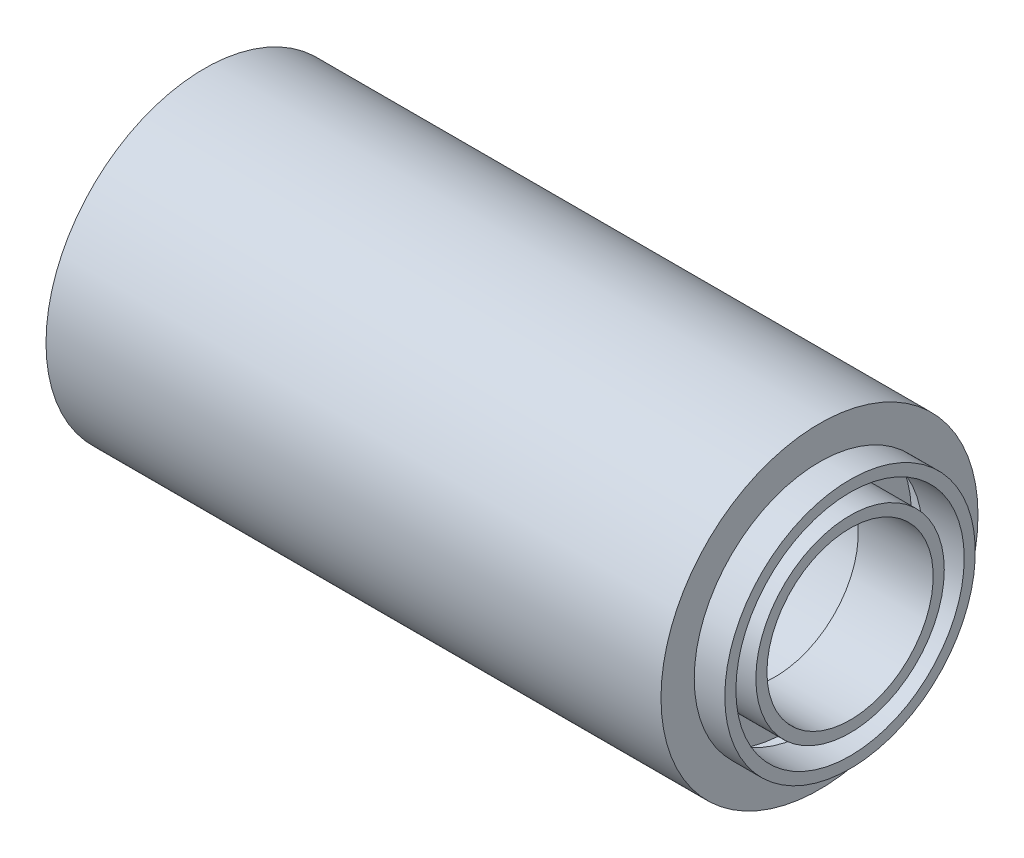
ISO-10303-21;
HEADER;
FILE_DESCRIPTION(('STEP AP214'),'2;1');
FILE_NAME('part.step','',(''),(''),'','','');
FILE_SCHEMA(('AUTOMOTIVE_DESIGN { 1 0 10303 214 1 1 1 1 }'));
ENDSEC;
DATA;
#1=APPLICATION_CONTEXT('core data for automotive mechanical design processes');
#2=APPLICATION_PROTOCOL_DEFINITION('international standard','automotive_design',2000,#1);
#3=PRODUCT_CONTEXT('',#1,'mechanical');
#4=PRODUCT('Part','Part','',(#3));
#5=PRODUCT_RELATED_PRODUCT_CATEGORY('part','',(#4));
#6=PRODUCT_DEFINITION_FORMATION('','',#4);
#7=PRODUCT_DEFINITION_CONTEXT('part definition',#1,'design');
#8=PRODUCT_DEFINITION('design','',#6,#7);
#9=PRODUCT_DEFINITION_SHAPE('','',#8);
#10=(LENGTH_UNIT() NAMED_UNIT(*) SI_UNIT(.MILLI.,.METRE.));
#11=(NAMED_UNIT(*) PLANE_ANGLE_UNIT() SI_UNIT($,.RADIAN.));
#12=(NAMED_UNIT(*) SI_UNIT($,.STERADIAN.) SOLID_ANGLE_UNIT());
#13=UNCERTAINTY_MEASURE_WITH_UNIT(LENGTH_MEASURE(1.E-05),#10,'distance_accuracy_value','');
#14=(GEOMETRIC_REPRESENTATION_CONTEXT(3) GLOBAL_UNCERTAINTY_ASSIGNED_CONTEXT((#13)) GLOBAL_UNIT_ASSIGNED_CONTEXT((#10,
#11,#12)) REPRESENTATION_CONTEXT('',''));
#15=CARTESIAN_POINT('',(0.,0.,0.));
#16=DIRECTION('',(0.,0.,1.));
#17=DIRECTION('',(1.,0.,0.));
#18=AXIS2_PLACEMENT_3D('',#15,#16,#17);
#19=CARTESIAN_POINT('',(-5.08,33.782,0.));
#20=DIRECTION('',(1.,0.,0.));
#21=DIRECTION('',(0.,0.,-1.));
#22=AXIS2_PLACEMENT_3D('',#19,#20,#21);
#23=PLANE('',#22);
#24=CARTESIAN_POINT('',(-5.08,0.,0.));
#25=DIRECTION('',(-1.,0.,0.));
#26=DIRECTION('',(0.,0.,1.));
#27=AXIS2_PLACEMENT_3D('',#24,#25,#26);
#28=CIRCLE('',#27,26.162);
#29=CARTESIAN_POINT('',(-5.08,0.,26.162));
#30=VERTEX_POINT('',#29);
#31=EDGE_CURVE('E86',#30,#30,#28,.T.);
#32=ORIENTED_EDGE('',*,*,#31,.T.);
#33=EDGE_LOOP('',(#32));
#34=FACE_BOUND('',#33,.T.);
#35=CARTESIAN_POINT('',(-5.08,0.,0.));
#36=DIRECTION('',(-1.,0.,0.));
#37=DIRECTION('',(0.,0.,1.));
#38=AXIS2_PLACEMENT_3D('',#35,#36,#37);
#39=CIRCLE('',#38,33.782);
#40=CARTESIAN_POINT('',(-5.08,0.,33.782));
#41=VERTEX_POINT('',#40);
#42=EDGE_CURVE('E11',#41,#41,#39,.T.);
#43=ORIENTED_EDGE('',*,*,#42,.F.);
#44=EDGE_LOOP('',(#43));
#45=FACE_BOUND('',#44,.T.);
#46=ADVANCED_FACE('F45',(#34,#45),#23,.T.);
#47=CARTESIAN_POINT('',(0.,0.,0.));
#48=DIRECTION('',(-1.,0.,0.));
#49=DIRECTION('',(0.,0.,1.));
#50=AXIS2_PLACEMENT_3D('',#47,#48,#49);
#51=CYLINDRICAL_SURFACE('',#50,26.162);
#52=CARTESIAN_POINT('',(-12.0906426511695,0.,0.));
#53=DIRECTION('',(-1.,0.,0.));
#54=DIRECTION('',(0.,0.,1.));
#55=AXIS2_PLACEMENT_3D('',#52,#53,#54);
#56=CIRCLE('',#55,26.162);
#57=CARTESIAN_POINT('',(-12.0906426511695,0.,26.162));
#58=VERTEX_POINT('',#57);
#59=EDGE_CURVE('E83',#58,#58,#56,.T.);
#60=ORIENTED_EDGE('',*,*,#59,.T.);
#61=EDGE_LOOP('',(#60));
#62=FACE_BOUND('',#61,.T.);
#63=ORIENTED_EDGE('',*,*,#31,.F.);
#64=EDGE_LOOP('',(#63));
#65=FACE_BOUND('',#64,.T.);
#66=ADVANCED_FACE('F92',(#62,#65),#51,.F.);
#67=CARTESIAN_POINT('',(-12.0906426511695,28.702,0.));
#68=DIRECTION('',(1.,0.,0.));
#69=DIRECTION('',(0.,0.,-1.));
#70=AXIS2_PLACEMENT_3D('',#67,#68,#69);
#71=PLANE('',#70);
#72=ORIENTED_EDGE('',*,*,#59,.F.);
#73=EDGE_LOOP('',(#72));
#74=FACE_BOUND('',#73,.T.);
#75=CARTESIAN_POINT('',(-12.0906426511695,0.,0.));
#76=DIRECTION('',(-1.,0.,0.));
#77=DIRECTION('',(0.,0.,1.));
#78=AXIS2_PLACEMENT_3D('',#75,#76,#77);
#79=CIRCLE('',#78,28.702);
#80=CARTESIAN_POINT('',(-12.0906426511695,0.,28.702));
#81=VERTEX_POINT('',#80);
#82=EDGE_CURVE('E80',#81,#81,#79,.T.);
#83=ORIENTED_EDGE('',*,*,#82,.T.);
#84=EDGE_LOOP('',(#83));
#85=FACE_BOUND('',#84,.T.);
#86=ADVANCED_FACE('F94',(#74,#85),#71,.F.);
#87=CARTESIAN_POINT('',(0.,0.,0.));
#88=DIRECTION('',(-1.,0.,0.));
#89=DIRECTION('',(0.,0.,1.));
#90=AXIS2_PLACEMENT_3D('',#87,#88,#89);
#91=CYLINDRICAL_SURFACE('',#90,28.702);
#92=CARTESIAN_POINT('',(-7.62,0.,0.));
#93=DIRECTION('',(-1.,0.,0.));
#94=DIRECTION('',(0.,0.,1.));
#95=AXIS2_PLACEMENT_3D('',#92,#93,#94);
#96=CIRCLE('',#95,28.702);
#97=CARTESIAN_POINT('',(-7.62,0.,28.702));
#98=VERTEX_POINT('',#97);
#99=EDGE_CURVE('E77',#98,#98,#96,.T.);
#100=ORIENTED_EDGE('',*,*,#99,.T.);
#101=EDGE_LOOP('',(#100));
#102=FACE_BOUND('',#101,.T.);
#103=ORIENTED_EDGE('',*,*,#82,.F.);
#104=EDGE_LOOP('',(#103));
#105=FACE_BOUND('',#104,.T.);
#106=ADVANCED_FACE('F101',(#102,#105),#91,.T.);
#107=CARTESIAN_POINT('',(-7.62,28.702,0.));
#108=DIRECTION('',(-1.,0.,0.));
#109=DIRECTION('',(0.,0.,1.));
#110=AXIS2_PLACEMENT_3D('',#107,#108,#109);
#111=PLANE('',#110);
#112=CARTESIAN_POINT('',(-7.62,0.,0.));
#113=DIRECTION('',(-1.,0.,0.));
#114=DIRECTION('',(0.,0.,1.));
#115=AXIS2_PLACEMENT_3D('',#112,#113,#114);
#116=CIRCLE('',#115,36.322);
#117=CARTESIAN_POINT('',(-7.62,0.,36.322));
#118=VERTEX_POINT('',#117);
#119=EDGE_CURVE('E74',#118,#118,#116,.T.);
#120=ORIENTED_EDGE('',*,*,#119,.T.);
#121=EDGE_LOOP('',(#120));
#122=FACE_BOUND('',#121,.T.);
#123=ORIENTED_EDGE('',*,*,#99,.F.);
#124=EDGE_LOOP('',(#123));
#125=FACE_BOUND('',#124,.T.);
#126=ADVANCED_FACE('F108',(#122,#125),#111,.T.);
#127=CARTESIAN_POINT('',(0.,0.,0.));
#128=DIRECTION('',(-1.,0.,0.));
#129=DIRECTION('',(0.,0.,1.));
#130=AXIS2_PLACEMENT_3D('',#127,#128,#129);
#131=CYLINDRICAL_SURFACE('',#130,36.322);
#132=CARTESIAN_POINT('',(133.304670970161,0.,0.));
#133=DIRECTION('',(-1.,0.,0.));
#134=DIRECTION('',(0.,0.,1.));
#135=AXIS2_PLACEMENT_3D('',#132,#133,#134);
#136=CIRCLE('',#135,36.322);
#137=CARTESIAN_POINT('',(133.304670970161,0.,36.322));
#138=VERTEX_POINT('',#137);
#139=EDGE_CURVE('E71',#138,#138,#136,.T.);
#140=ORIENTED_EDGE('',*,*,#139,.T.);
#141=EDGE_LOOP('',(#140));
#142=FACE_BOUND('',#141,.T.);
#143=ORIENTED_EDGE('',*,*,#119,.F.);
#144=EDGE_LOOP('',(#143));
#145=FACE_BOUND('',#144,.T.);
#146=ADVANCED_FACE('F112',(#142,#145),#131,.T.);
#147=CARTESIAN_POINT('',(133.304670970161,28.702,0.));
#148=DIRECTION('',(-1.,0.,0.));
#149=DIRECTION('',(0.,0.,1.));
#150=AXIS2_PLACEMENT_3D('',#147,#148,#149);
#151=PLANE('',#150);
#152=ORIENTED_EDGE('',*,*,#139,.F.);
#153=EDGE_LOOP('',(#152));
#154=FACE_BOUND('',#153,.T.);
#155=CARTESIAN_POINT('',(133.304670970161,0.,0.));
#156=DIRECTION('',(-1.,0.,0.));
#157=DIRECTION('',(0.,0.,1.));
#158=AXIS2_PLACEMENT_3D('',#155,#156,#157);
#159=CIRCLE('',#158,28.702);
#160=CARTESIAN_POINT('',(133.304670970161,0.,28.702));
#161=VERTEX_POINT('',#160);
#162=EDGE_CURVE('E68',#161,#161,#159,.T.);
#163=ORIENTED_EDGE('',*,*,#162,.T.);
#164=EDGE_LOOP('',(#163));
#165=FACE_BOUND('',#164,.T.);
#166=ADVANCED_FACE('F116',(#154,#165),#151,.F.);
#167=CARTESIAN_POINT('',(0.,0.,0.));
#168=DIRECTION('',(-1.,0.,0.));
#169=DIRECTION('',(0.,0.,1.));
#170=AXIS2_PLACEMENT_3D('',#167,#168,#169);
#171=CYLINDRICAL_SURFACE('',#170,28.702);
#172=ORIENTED_EDGE('',*,*,#162,.F.);
#173=EDGE_LOOP('',(#172));
#174=FACE_BOUND('',#173,.T.);
#175=CARTESIAN_POINT('',(140.309357348831,0.,0.));
#176=DIRECTION('',(-1.,0.,0.));
#177=DIRECTION('',(0.,0.,1.));
#178=AXIS2_PLACEMENT_3D('',#175,#176,#177);
#179=CIRCLE('',#178,28.702);
#180=CARTESIAN_POINT('',(140.309357348831,0.,28.702));
#181=VERTEX_POINT('',#180);
#182=EDGE_CURVE('E65',#181,#181,#179,.T.);
#183=ORIENTED_EDGE('',*,*,#182,.T.);
#184=EDGE_LOOP('',(#183));
#185=FACE_BOUND('',#184,.T.);
#186=ADVANCED_FACE('F120',(#174,#185),#171,.T.);
#187=CARTESIAN_POINT('',(140.309357348831,26.162,0.));
#188=DIRECTION('',(-1.,0.,0.));
#189=DIRECTION('',(0.,0.,1.));
#190=AXIS2_PLACEMENT_3D('',#187,#188,#189);
#191=PLANE('',#190);
#192=ORIENTED_EDGE('',*,*,#182,.F.);
#193=EDGE_LOOP('',(#192));
#194=FACE_BOUND('',#193,.T.);
#195=CARTESIAN_POINT('',(140.309357348831,0.,0.));
#196=DIRECTION('',(-1.,0.,0.));
#197=DIRECTION('',(0.,0.,1.));
#198=AXIS2_PLACEMENT_3D('',#195,#196,#197);
#199=CIRCLE('',#198,26.162);
#200=CARTESIAN_POINT('',(140.309357348831,0.,26.162));
#201=VERTEX_POINT('',#200);
#202=EDGE_CURVE('E60',#201,#201,#199,.T.);
#203=ORIENTED_EDGE('',*,*,#202,.T.);
#204=EDGE_LOOP('',(#203));
#205=FACE_BOUND('',#204,.T.);
#206=ADVANCED_FACE('F124',(#194,#205),#191,.F.);
#207=CARTESIAN_POINT('',(0.,0.,0.));
#208=DIRECTION('',(-1.,0.,0.));
#209=DIRECTION('',(0.,0.,1.));
#210=AXIS2_PLACEMENT_3D('',#207,#208,#209);
#211=CYLINDRICAL_SURFACE('',#210,26.162);
#212=ORIENTED_EDGE('',*,*,#202,.F.);
#213=EDGE_LOOP('',(#212));
#214=FACE_BOUND('',#213,.T.);
#215=CARTESIAN_POINT('',(130.764670970161,0.,0.));
#216=DIRECTION('',(-1.,0.,0.));
#217=DIRECTION('',(0.,0.,1.));
#218=AXIS2_PLACEMENT_3D('',#215,#216,#217);
#219=CIRCLE('',#218,26.162);
#220=CARTESIAN_POINT('',(130.764670970161,0.,26.162));
#221=VERTEX_POINT('',#220);
#222=EDGE_CURVE('E56',#221,#221,#219,.T.);
#223=ORIENTED_EDGE('',*,*,#222,.T.);
#224=EDGE_LOOP('',(#223));
#225=FACE_BOUND('',#224,.T.);
#226=ADVANCED_FACE('F128',(#214,#225),#211,.F.);
#227=CARTESIAN_POINT('',(130.764670970161,33.782,0.));
#228=DIRECTION('',(1.,0.,0.));
#229=DIRECTION('',(0.,0.,-1.));
#230=AXIS2_PLACEMENT_3D('',#227,#228,#229);
#231=PLANE('',#230);
#232=ORIENTED_EDGE('',*,*,#222,.F.);
#233=EDGE_LOOP('',(#232));
#234=FACE_BOUND('',#233,.T.);
#235=CARTESIAN_POINT('',(130.764670970161,0.,0.));
#236=DIRECTION('',(-1.,0.,0.));
#237=DIRECTION('',(0.,0.,1.));
#238=AXIS2_PLACEMENT_3D('',#235,#236,#237);
#239=CIRCLE('',#238,33.782);
#240=CARTESIAN_POINT('',(130.764670970161,0.,33.782));
#241=VERTEX_POINT('',#240);
#242=EDGE_CURVE('E52',#241,#241,#239,.T.);
#243=ORIENTED_EDGE('',*,*,#242,.T.);
#244=EDGE_LOOP('',(#243));
#245=FACE_BOUND('',#244,.T.);
#246=ADVANCED_FACE('F131',(#234,#245),#231,.F.);
#247=CARTESIAN_POINT('',(0.,0.,0.));
#248=DIRECTION('',(-1.,0.,0.));
#249=DIRECTION('',(0.,0.,1.));
#250=AXIS2_PLACEMENT_3D('',#247,#248,#249);
#251=CYLINDRICAL_SURFACE('',#250,33.782);
#252=ORIENTED_EDGE('',*,*,#242,.F.);
#253=EDGE_LOOP('',(#252));
#254=FACE_BOUND('',#253,.T.);
#255=ORIENTED_EDGE('',*,*,#42,.T.);
#256=EDGE_LOOP('',(#255));
#257=FACE_BOUND('',#256,.T.);
#258=ADVANCED_FACE('F47',(#254,#257),#251,.F.);
#259=CLOSED_SHELL('',(#46,#66,#86,#106,#126,#146,#166,#186,#206,#226,#246,#258));
#260=MANIFOLD_SOLID_BREP('B2',#259);
#261=CARTESIAN_POINT('',(0.,0.,0.));
#262=DIRECTION('',(-1.,0.,0.));
#263=DIRECTION('',(0.,0.,1.));
#264=AXIS2_PLACEMENT_3D('',#261,#262,#263);
#265=CYLINDRICAL_SURFACE('',#264,21.59);
#266=CARTESIAN_POINT('',(125.684670970161,0.,0.));
#267=DIRECTION('',(-1.,0.,0.));
#268=DIRECTION('',(0.,0.,1.));
#269=AXIS2_PLACEMENT_3D('',#266,#267,#268);
#270=CIRCLE('',#269,21.59);
#271=CARTESIAN_POINT('',(125.684670970161,0.,21.59));
#272=VERTEX_POINT('',#271);
#273=EDGE_CURVE('E44',#272,#272,#270,.T.);
#274=ORIENTED_EDGE('',*,*,#273,.F.);
#275=EDGE_LOOP('',(#274));
#276=FACE_BOUND('',#275,.T.);
#277=CARTESIAN_POINT('',(140.309357348831,0.,0.));
#278=DIRECTION('',(-1.,0.,0.));
#279=DIRECTION('',(0.,0.,1.));
#280=AXIS2_PLACEMENT_3D('',#277,#278,#279);
#281=CIRCLE('',#280,21.59);
#282=CARTESIAN_POINT('',(140.309357348831,0.,21.59));
#283=VERTEX_POINT('',#282);
#284=EDGE_CURVE('E291',#283,#283,#281,.T.);
#285=ORIENTED_EDGE('',*,*,#284,.T.);
#286=EDGE_LOOP('',(#285));
#287=FACE_BOUND('',#286,.T.);
#288=ADVANCED_FACE('F251',(#276,#287),#265,.T.);
#289=CARTESIAN_POINT('',(125.684670970161,0.,0.));
#290=DIRECTION('',(-1.,0.,0.));
#291=DIRECTION('',(0.,0.,1.));
#292=AXIS2_PLACEMENT_3D('',#289,#290,#291);
#293=PLANE('',#292);
#294=CARTESIAN_POINT('',(125.684670970161,0.,0.));
#295=DIRECTION('',(-1.,0.,0.));
#296=DIRECTION('',(0.,0.,1.));
#297=AXIS2_PLACEMENT_3D('',#294,#295,#296);
#298=CIRCLE('',#297,28.702);
#299=CARTESIAN_POINT('',(125.684670970161,0.,28.702));
#300=VERTEX_POINT('',#299);
#301=EDGE_CURVE('E257',#300,#300,#298,.T.);
#302=ORIENTED_EDGE('',*,*,#301,.F.);
#303=EDGE_LOOP('',(#302));
#304=FACE_BOUND('',#303,.T.);
#305=ORIENTED_EDGE('',*,*,#273,.T.);
#306=EDGE_LOOP('',(#305));
#307=FACE_BOUND('',#306,.T.);
#308=ADVANCED_FACE('F352',(#304,#307),#293,.F.);
#309=CARTESIAN_POINT('',(0.,0.,0.));
#310=DIRECTION('',(-1.,0.,0.));
#311=DIRECTION('',(0.,0.,1.));
#312=AXIS2_PLACEMENT_3D('',#309,#310,#311);
#313=CYLINDRICAL_SURFACE('',#312,28.702);
#314=ORIENTED_EDGE('',*,*,#301,.T.);
#315=EDGE_LOOP('',(#314));
#316=FACE_BOUND('',#315,.T.);
#317=CARTESIAN_POINT('',(0.,0.,0.));
#318=DIRECTION('',(-1.,0.,0.));
#319=DIRECTION('',(0.,0.,1.));
#320=AXIS2_PLACEMENT_3D('',#317,#318,#319);
#321=CIRCLE('',#320,28.702);
#322=CARTESIAN_POINT('',(0.,0.,28.702));
#323=VERTEX_POINT('',#322);
#324=EDGE_CURVE('E261',#323,#323,#321,.T.);
#325=ORIENTED_EDGE('',*,*,#324,.F.);
#326=EDGE_LOOP('',(#325));
#327=FACE_BOUND('',#326,.T.);
#328=ADVANCED_FACE('F347',(#316,#327),#313,.T.);
#329=CARTESIAN_POINT('',(0.,0.,0.));
#330=DIRECTION('',(1.,0.,0.));
#331=DIRECTION('',(0.,0.,-1.));
#332=AXIS2_PLACEMENT_3D('',#329,#330,#331);
#333=PLANE('',#332);
#334=CARTESIAN_POINT('',(0.,0.,0.));
#335=DIRECTION('',(-1.,0.,0.));
#336=DIRECTION('',(0.,0.,1.));
#337=AXIS2_PLACEMENT_3D('',#334,#335,#336);
#338=CIRCLE('',#337,21.59);
#339=CARTESIAN_POINT('',(0.,0.,21.59));
#340=VERTEX_POINT('',#339);
#341=EDGE_CURVE('E265',#340,#340,#338,.T.);
#342=ORIENTED_EDGE('',*,*,#341,.F.);
#343=EDGE_LOOP('',(#342));
#344=FACE_BOUND('',#343,.T.);
#345=ORIENTED_EDGE('',*,*,#324,.T.);
#346=EDGE_LOOP('',(#345));
#347=FACE_BOUND('',#346,.T.);
#348=ADVANCED_FACE('F341',(#344,#347),#333,.F.);
#349=CARTESIAN_POINT('',(0.,0.,0.));
#350=DIRECTION('',(-1.,0.,0.));
#351=DIRECTION('',(0.,0.,1.));
#352=AXIS2_PLACEMENT_3D('',#349,#350,#351);
#353=CYLINDRICAL_SURFACE('',#352,21.59);
#354=CARTESIAN_POINT('',(-12.0906426511695,0.,0.));
#355=DIRECTION('',(-1.,0.,0.));
#356=DIRECTION('',(0.,0.,1.));
#357=AXIS2_PLACEMENT_3D('',#354,#355,#356);
#358=CIRCLE('',#357,21.59);
#359=CARTESIAN_POINT('',(-12.0906426511695,0.,21.59));
#360=VERTEX_POINT('',#359);
#361=EDGE_CURVE('E270',#360,#360,#358,.T.);
#362=ORIENTED_EDGE('',*,*,#361,.F.);
#363=EDGE_LOOP('',(#362));
#364=FACE_BOUND('',#363,.T.);
#365=ORIENTED_EDGE('',*,*,#341,.T.);
#366=EDGE_LOOP('',(#365));
#367=FACE_BOUND('',#366,.T.);
#368=ADVANCED_FACE('F335',(#364,#367),#353,.T.);
#369=CARTESIAN_POINT('',(-12.0906426511695,0.,0.));
#370=DIRECTION('',(1.,0.,0.));
#371=DIRECTION('',(0.,0.,-1.));
#372=AXIS2_PLACEMENT_3D('',#369,#370,#371);
#373=PLANE('',#372);
#374=CARTESIAN_POINT('',(-12.0906426511695,0.,0.));
#375=DIRECTION('',(-1.,0.,0.));
#376=DIRECTION('',(0.,0.,1.));
#377=AXIS2_PLACEMENT_3D('',#374,#375,#376);
#378=CIRCLE('',#377,19.05);
#379=CARTESIAN_POINT('',(-12.0906426511695,0.,19.05));
#380=VERTEX_POINT('',#379);
#381=EDGE_CURVE('E273',#380,#380,#378,.T.);
#382=ORIENTED_EDGE('',*,*,#381,.F.);
#383=EDGE_LOOP('',(#382));
#384=FACE_BOUND('',#383,.T.);
#385=ORIENTED_EDGE('',*,*,#361,.T.);
#386=EDGE_LOOP('',(#385));
#387=FACE_BOUND('',#386,.T.);
#388=ADVANCED_FACE('F329',(#384,#387),#373,.F.);
#389=CARTESIAN_POINT('',(0.,0.,0.));
#390=DIRECTION('',(-1.,0.,0.));
#391=DIRECTION('',(0.,0.,1.));
#392=AXIS2_PLACEMENT_3D('',#389,#390,#391);
#393=CYLINDRICAL_SURFACE('',#392,19.05);
#394=CARTESIAN_POINT('',(2.54,0.,0.));
#395=DIRECTION('',(-1.,0.,0.));
#396=DIRECTION('',(0.,0.,1.));
#397=AXIS2_PLACEMENT_3D('',#394,#395,#396);
#398=CIRCLE('',#397,19.05);
#399=CARTESIAN_POINT('',(2.54,0.,19.05));
#400=VERTEX_POINT('',#399);
#401=EDGE_CURVE('E276',#400,#400,#398,.T.);
#402=ORIENTED_EDGE('',*,*,#401,.F.);
#403=EDGE_LOOP('',(#402));
#404=FACE_BOUND('',#403,.T.);
#405=ORIENTED_EDGE('',*,*,#381,.T.);
#406=EDGE_LOOP('',(#405));
#407=FACE_BOUND('',#406,.T.);
#408=ADVANCED_FACE('F323',(#404,#407),#393,.F.);
#409=CARTESIAN_POINT('',(2.54,0.,0.));
#410=DIRECTION('',(-1.,0.,0.));
#411=DIRECTION('',(0.,0.,1.));
#412=AXIS2_PLACEMENT_3D('',#409,#410,#411);
#413=PLANE('',#412);
#414=CARTESIAN_POINT('',(2.54,0.,0.));
#415=DIRECTION('',(-1.,0.,0.));
#416=DIRECTION('',(0.,0.,1.));
#417=AXIS2_PLACEMENT_3D('',#414,#415,#416);
#418=CIRCLE('',#417,26.162);
#419=CARTESIAN_POINT('',(2.54,0.,26.162));
#420=VERTEX_POINT('',#419);
#421=EDGE_CURVE('E279',#420,#420,#418,.T.);
#422=ORIENTED_EDGE('',*,*,#421,.F.);
#423=EDGE_LOOP('',(#422));
#424=FACE_BOUND('',#423,.T.);
#425=ORIENTED_EDGE('',*,*,#401,.T.);
#426=EDGE_LOOP('',(#425));
#427=FACE_BOUND('',#426,.T.);
#428=ADVANCED_FACE('F317',(#424,#427),#413,.F.);
#429=CARTESIAN_POINT('',(0.,0.,0.));
#430=DIRECTION('',(-1.,0.,0.));
#431=DIRECTION('',(0.,0.,1.));
#432=AXIS2_PLACEMENT_3D('',#429,#430,#431);
#433=CYLINDRICAL_SURFACE('',#432,26.162);
#434=CARTESIAN_POINT('',(123.144670970161,0.,0.));
#435=DIRECTION('',(-1.,0.,0.));
#436=DIRECTION('',(0.,0.,1.));
#437=AXIS2_PLACEMENT_3D('',#434,#435,#436);
#438=CIRCLE('',#437,26.162);
#439=CARTESIAN_POINT('',(123.144670970161,0.,26.162));
#440=VERTEX_POINT('',#439);
#441=EDGE_CURVE('E282',#440,#440,#438,.T.);
#442=ORIENTED_EDGE('',*,*,#441,.F.);
#443=EDGE_LOOP('',(#442));
#444=FACE_BOUND('',#443,.T.);
#445=ORIENTED_EDGE('',*,*,#421,.T.);
#446=EDGE_LOOP('',(#445));
#447=FACE_BOUND('',#446,.T.);
#448=ADVANCED_FACE('F311',(#444,#447),#433,.F.);
#449=CARTESIAN_POINT('',(123.144670970161,0.,0.));
#450=DIRECTION('',(1.,0.,0.));
#451=DIRECTION('',(0.,0.,-1.));
#452=AXIS2_PLACEMENT_3D('',#449,#450,#451);
#453=PLANE('',#452);
#454=CARTESIAN_POINT('',(123.144670970161,0.,0.));
#455=DIRECTION('',(-1.,0.,0.));
#456=DIRECTION('',(0.,0.,1.));
#457=AXIS2_PLACEMENT_3D('',#454,#455,#456);
#458=CIRCLE('',#457,19.05);
#459=CARTESIAN_POINT('',(123.144670970161,0.,19.05));
#460=VERTEX_POINT('',#459);
#461=EDGE_CURVE('E285',#460,#460,#458,.T.);
#462=ORIENTED_EDGE('',*,*,#461,.F.);
#463=EDGE_LOOP('',(#462));
#464=FACE_BOUND('',#463,.T.);
#465=ORIENTED_EDGE('',*,*,#441,.T.);
#466=EDGE_LOOP('',(#465));
#467=FACE_BOUND('',#466,.T.);
#468=ADVANCED_FACE('F305',(#464,#467),#453,.F.);
#469=CARTESIAN_POINT('',(0.,0.,0.));
#470=DIRECTION('',(-1.,0.,0.));
#471=DIRECTION('',(0.,0.,1.));
#472=AXIS2_PLACEMENT_3D('',#469,#470,#471);
#473=CYLINDRICAL_SURFACE('',#472,19.05);
#474=CARTESIAN_POINT('',(140.309357348831,0.,0.));
#475=DIRECTION('',(-1.,0.,0.));
#476=DIRECTION('',(0.,0.,1.));
#477=AXIS2_PLACEMENT_3D('',#474,#475,#476);
#478=CIRCLE('',#477,19.05);
#479=CARTESIAN_POINT('',(140.309357348831,0.,19.05));
#480=VERTEX_POINT('',#479);
#481=EDGE_CURVE('E288',#480,#480,#478,.T.);
#482=ORIENTED_EDGE('',*,*,#481,.F.);
#483=EDGE_LOOP('',(#482));
#484=FACE_BOUND('',#483,.T.);
#485=ORIENTED_EDGE('',*,*,#461,.T.);
#486=EDGE_LOOP('',(#485));
#487=FACE_BOUND('',#486,.T.);
#488=ADVANCED_FACE('F299',(#484,#487),#473,.F.);
#489=CARTESIAN_POINT('',(140.309357348831,0.,0.));
#490=DIRECTION('',(-1.,0.,0.));
#491=DIRECTION('',(0.,0.,1.));
#492=AXIS2_PLACEMENT_3D('',#489,#490,#491);
#493=PLANE('',#492);
#494=ORIENTED_EDGE('',*,*,#284,.F.);
#495=EDGE_LOOP('',(#494));
#496=FACE_BOUND('',#495,.T.);
#497=ORIENTED_EDGE('',*,*,#481,.T.);
#498=EDGE_LOOP('',(#497));
#499=FACE_BOUND('',#498,.T.);
#500=ADVANCED_FACE('F296',(#496,#499),#493,.F.);
#501=CLOSED_SHELL('',(#288,#308,#328,#348,#368,#388,#408,#428,#448,#468,#488,#500));
#502=MANIFOLD_SOLID_BREP('B6',#501);
#503=ADVANCED_BREP_SHAPE_REPRESENTATION('',(#18,#260,#502),#14);
#504=SHAPE_DEFINITION_REPRESENTATION(#9,#503);
ENDSEC;
END-ISO-10303-21;
